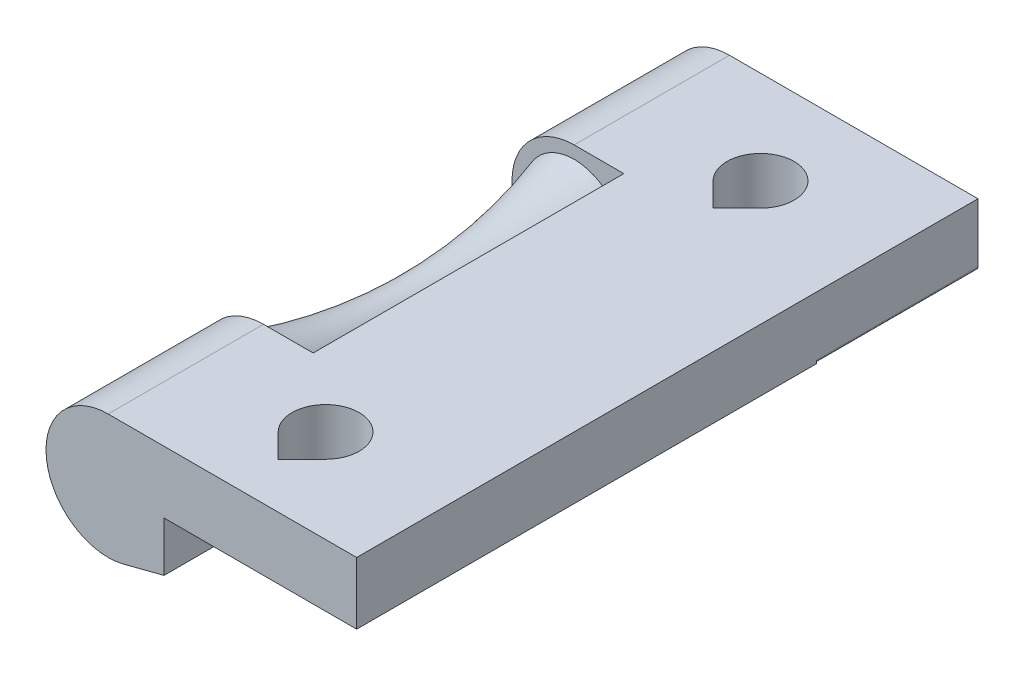
ISO-10303-21;
HEADER;
FILE_DESCRIPTION(('STEP AP214'),'2;1');
FILE_NAME('part.step','',(''),(''),'','','');
FILE_SCHEMA(('AUTOMOTIVE_DESIGN { 1 0 10303 214 1 1 1 1 }'));
ENDSEC;
DATA;
#1=APPLICATION_CONTEXT('core data for automotive mechanical design processes');
#2=APPLICATION_PROTOCOL_DEFINITION('international standard','automotive_design',2000,#1);
#3=PRODUCT_CONTEXT('',#1,'mechanical');
#4=PRODUCT('Part','Part','',(#3));
#5=PRODUCT_RELATED_PRODUCT_CATEGORY('part','',(#4));
#6=PRODUCT_DEFINITION_FORMATION('','',#4);
#7=PRODUCT_DEFINITION_CONTEXT('part definition',#1,'design');
#8=PRODUCT_DEFINITION('design','',#6,#7);
#9=PRODUCT_DEFINITION_SHAPE('','',#8);
#10=(LENGTH_UNIT() NAMED_UNIT(*) SI_UNIT(.MILLI.,.METRE.));
#11=(NAMED_UNIT(*) PLANE_ANGLE_UNIT() SI_UNIT($,.RADIAN.));
#12=(NAMED_UNIT(*) SI_UNIT($,.STERADIAN.) SOLID_ANGLE_UNIT());
#13=UNCERTAINTY_MEASURE_WITH_UNIT(LENGTH_MEASURE(1.E-05),#10,'distance_accuracy_value','');
#14=(GEOMETRIC_REPRESENTATION_CONTEXT(3) GLOBAL_UNCERTAINTY_ASSIGNED_CONTEXT((#13)) GLOBAL_UNIT_ASSIGNED_CONTEXT((#10,
#11,#12)) REPRESENTATION_CONTEXT('',''));
#15=CARTESIAN_POINT('',(0.,0.,0.));
#16=DIRECTION('',(0.,0.,1.));
#17=DIRECTION('',(1.,0.,0.));
#18=AXIS2_PLACEMENT_3D('',#15,#16,#17);
#19=CARTESIAN_POINT('',(20.,0.,0.));
#20=DIRECTION('',(-1.,0.,0.));
#21=DIRECTION('',(0.,0.,1.));
#22=AXIS2_PLACEMENT_3D('',#19,#20,#21);
#23=PLANE('',#22);
#24=DIRECTION('',(0.,0.,1.));
#25=VECTOR('',#24,1.);
#26=CARTESIAN_POINT('',(20.,0.,-12.));
#27=LINE('',#26,#25);
#28=CARTESIAN_POINT('',(20.,0.,-12.));
#29=VERTEX_POINT('',#28);
#30=CARTESIAN_POINT('',(20.,0.,12.));
#31=VERTEX_POINT('',#30);
#32=EDGE_CURVE('E373',#29,#31,#27,.T.);
#33=ORIENTED_EDGE('',*,*,#32,.F.);
#34=DIRECTION('',(0.,1.,0.));
#35=VECTOR('',#34,1.);
#36=CARTESIAN_POINT('',(20.,0.,-12.));
#37=LINE('',#36,#35);
#38=CARTESIAN_POINT('',(20.,0.25,-12.));
#39=VERTEX_POINT('',#38);
#40=EDGE_CURVE('E56',#29,#39,#37,.T.);
#41=ORIENTED_EDGE('',*,*,#40,.T.);
#42=DIRECTION('',(0.,0.,1.));
#43=VECTOR('',#42,1.);
#44=CARTESIAN_POINT('',(20.,0.25,-25.));
#45=LINE('',#44,#43);
#46=CARTESIAN_POINT('',(20.,0.25,-25.));
#47=VERTEX_POINT('',#46);
#48=EDGE_CURVE('E829',#39,#47,#45,.F.);
#49=ORIENTED_EDGE('',*,*,#48,.T.);
#50=DIRECTION('',(0.,-1.,0.));
#51=VECTOR('',#50,1.);
#52=CARTESIAN_POINT('',(20.,0.,-25.));
#53=LINE('',#52,#51);
#54=CARTESIAN_POINT('',(20.,5.00000000000002,-25.));
#55=VERTEX_POINT('',#54);
#56=EDGE_CURVE('E269',#55,#47,#53,.T.);
#57=ORIENTED_EDGE('',*,*,#56,.F.);
#58=DIRECTION('',(0.,0.,1.));
#59=VECTOR('',#58,1.);
#60=CARTESIAN_POINT('',(20.,5.00000000000002,25.000000372529));
#61=LINE('',#60,#59);
#62=CARTESIAN_POINT('',(20.,5.00000000000002,25.000000372529));
#63=VERTEX_POINT('',#62);
#64=EDGE_CURVE('E378',#55,#63,#61,.T.);
#65=ORIENTED_EDGE('',*,*,#64,.T.);
#66=DIRECTION('',(0.,-1.,0.));
#67=VECTOR('',#66,1.);
#68=CARTESIAN_POINT('',(20.,-4.00208279108101,25.000000372529));
#69=LINE('',#68,#67);
#70=CARTESIAN_POINT('',(20.,0.,25.000000372529));
#71=VERTEX_POINT('',#70);
#72=EDGE_CURVE('E381',#63,#71,#69,.T.);
#73=ORIENTED_EDGE('',*,*,#72,.T.);
#74=DIRECTION('',(0.,0.,1.));
#75=VECTOR('',#74,1.);
#76=CARTESIAN_POINT('',(20.,0.,12.));
#77=LINE('',#76,#75);
#78=EDGE_CURVE('E290',#31,#71,#77,.T.);
#79=ORIENTED_EDGE('',*,*,#78,.F.);
#80=EDGE_LOOP('',(#33,#41,#49,#57,#65,#73,#79));
#81=FACE_BOUND('',#80,.T.);
#82=ADVANCED_FACE('F42',(#81),#23,.F.);
#83=CARTESIAN_POINT('',(20.,5.00000000000002,-25.));
#84=DIRECTION('',(0.,1.,0.));
#85=DIRECTION('',(0.,0.,1.));
#86=AXIS2_PLACEMENT_3D('',#83,#84,#85);
#87=PLANE('',#86);
#88=CARTESIAN_POINT('',(10.,5.00000000000002,-17.5));
#89=DIRECTION('',(0.,1.,0.));
#90=DIRECTION('',(0.,0.,1.));
#91=AXIS2_PLACEMENT_3D('',#88,#89,#90);
#92=CIRCLE('',#91,2.70000000000002);
#93=CARTESIAN_POINT('',(11.9091883092037,5.00000000000002,-15.5908116907963));
#94=VERTEX_POINT('',#93);
#95=CARTESIAN_POINT('',(8.09081169079631,5.00000000000002,-15.5908116907963));
#96=VERTEX_POINT('',#95);
#97=EDGE_CURVE('E228',#94,#96,#92,.T.);
#98=ORIENTED_EDGE('',*,*,#97,.F.);
#99=DIRECTION('',(0.707106781186544,0.,-0.707106781186551));
#100=VECTOR('',#99,1.);
#101=CARTESIAN_POINT('',(10.,5.00000000000002,-13.6816233815926));
#102=LINE('',#101,#100);
#103=CARTESIAN_POINT('',(10.,5.00000000000002,-13.6816233815926));
#104=VERTEX_POINT('',#103);
#105=EDGE_CURVE('E229',#104,#94,#102,.T.);
#106=ORIENTED_EDGE('',*,*,#105,.F.);
#107=DIRECTION('',(0.707106781186544,0.,0.707106781186551));
#108=VECTOR('',#107,1.);
#109=CARTESIAN_POINT('',(8.09081169079631,5.00000000000002,-15.5908116907963));
#110=LINE('',#109,#108);
#111=EDGE_CURVE('E235',#96,#104,#110,.T.);
#112=ORIENTED_EDGE('',*,*,#111,.F.);
#113=EDGE_LOOP('',(#98,#106,#112));
#114=FACE_BOUND('',#113,.T.);
#115=CARTESIAN_POINT('',(10.,5.00000000000002,17.5));
#116=DIRECTION('',(0.,1.,0.));
#117=DIRECTION('',(0.,0.,1.));
#118=AXIS2_PLACEMENT_3D('',#115,#116,#117);
#119=CIRCLE('',#118,2.70000000000001);
#120=CARTESIAN_POINT('',(11.9091883092037,5.00000000000002,19.4091883092037));
#121=VERTEX_POINT('',#120);
#122=CARTESIAN_POINT('',(8.09081169079631,5.00000000000002,19.4091883092037));
#123=VERTEX_POINT('',#122);
#124=EDGE_CURVE('E251',#121,#123,#119,.T.);
#125=ORIENTED_EDGE('',*,*,#124,.F.);
#126=DIRECTION('',(0.707106781186543,0.,-0.707106781186552));
#127=VECTOR('',#126,1.);
#128=CARTESIAN_POINT('',(10.,5.00000000000002,21.3183766184074));
#129=LINE('',#128,#127);
#130=CARTESIAN_POINT('',(10.,5.00000000000002,21.3183766184074));
#131=VERTEX_POINT('',#130);
#132=EDGE_CURVE('E256',#131,#121,#129,.T.);
#133=ORIENTED_EDGE('',*,*,#132,.F.);
#134=DIRECTION('',(0.707106781186543,0.,0.707106781186552));
#135=VECTOR('',#134,1.);
#136=CARTESIAN_POINT('',(8.09081169079631,5.00000000000002,19.4091883092037));
#137=LINE('',#136,#135);
#138=EDGE_CURVE('E253',#123,#131,#137,.T.);
#139=ORIENTED_EDGE('',*,*,#138,.F.);
#140=EDGE_LOOP('',(#125,#133,#139));
#141=FACE_BOUND('',#140,.T.);
#142=DIRECTION('',(0.,0.,1.));
#143=VECTOR('',#142,1.);
#144=CARTESIAN_POINT('',(0.,5.00000000000002,-25.));
#145=LINE('',#144,#143);
#146=CARTESIAN_POINT('',(0.,5.00000000000002,-25.));
#147=VERTEX_POINT('',#146);
#148=CARTESIAN_POINT('',(0.,5.00000000000002,-12.5));
#149=VERTEX_POINT('',#148);
#150=EDGE_CURVE('E397',#147,#149,#145,.T.);
#151=ORIENTED_EDGE('',*,*,#150,.T.);
#152=DIRECTION('',(-1.,0.,0.));
#153=VECTOR('',#152,1.);
#154=CARTESIAN_POINT('',(3.99999999999998,5.00000000000002,-12.5));
#155=LINE('',#154,#153);
#156=CARTESIAN_POINT('',(3.99999999999998,5.00000000000002,-12.5));
#157=VERTEX_POINT('',#156);
#158=EDGE_CURVE('E323',#157,#149,#155,.T.);
#159=ORIENTED_EDGE('',*,*,#158,.F.);
#160=DIRECTION('',(0.,0.,1.));
#161=VECTOR('',#160,1.);
#162=CARTESIAN_POINT('',(3.99999999999998,5.00000000000002,-12.5));
#163=LINE('',#162,#161);
#164=CARTESIAN_POINT('',(3.99999999999998,5.00000000000002,12.5));
#165=VERTEX_POINT('',#164);
#166=EDGE_CURVE('E340',#157,#165,#163,.T.);
#167=ORIENTED_EDGE('',*,*,#166,.T.);
#168=DIRECTION('',(-1.,0.,0.));
#169=VECTOR('',#168,1.);
#170=CARTESIAN_POINT('',(3.99999999999998,5.00000000000002,12.5));
#171=LINE('',#170,#169);
#172=CARTESIAN_POINT('',(0.,5.00000000000002,12.5));
#173=VERTEX_POINT('',#172);
#174=EDGE_CURVE('E343',#165,#173,#171,.T.);
#175=ORIENTED_EDGE('',*,*,#174,.T.);
#176=CARTESIAN_POINT('',(0.,5.00000000000001,25.000000372529));
#177=VERTEX_POINT('',#176);
#178=EDGE_CURVE('E403',#173,#177,#145,.T.);
#179=ORIENTED_EDGE('',*,*,#178,.T.);
#180=DIRECTION('',(-1.,0.,0.));
#181=VECTOR('',#180,1.);
#182=CARTESIAN_POINT('',(0.,5.00000000000002,25.000000372529));
#183=LINE('',#182,#181);
#184=EDGE_CURVE('E384',#63,#177,#183,.T.);
#185=ORIENTED_EDGE('',*,*,#184,.F.);
#186=ORIENTED_EDGE('',*,*,#64,.F.);
#187=DIRECTION('',(1.,0.,0.));
#188=VECTOR('',#187,1.);
#189=CARTESIAN_POINT('',(20.,5.00000000000002,-25.));
#190=LINE('',#189,#188);
#191=EDGE_CURVE('E282',#147,#55,#190,.T.);
#192=ORIENTED_EDGE('',*,*,#191,.F.);
#193=EDGE_LOOP('',(#151,#159,#167,#175,#179,#185,#186,#192));
#194=FACE_BOUND('',#193,.T.);
#195=ADVANCED_FACE('F866',(#114,#141,#194),#87,.T.);
#196=CARTESIAN_POINT('',(1.25000000000004,-4.84122918275929,-25.));
#197=DIRECTION('',(0.250000000000001,-0.968245836551854,0.));
#198=DIRECTION('',(0.968245836551854,0.250000000000001,0.));
#199=AXIS2_PLACEMENT_3D('',#196,#197,#198);
#200=PLANE('',#199);
#201=DIRECTION('',(0.,0.,1.));
#202=VECTOR('',#201,1.);
#203=CARTESIAN_POINT('',(4.31249999999998,-4.05049508290861,-12.5));
#204=LINE('',#203,#202);
#205=CARTESIAN_POINT('',(4.31249999999998,-4.05049508290861,-12.5));
#206=VERTEX_POINT('',#205);
#207=CARTESIAN_POINT('',(4.31249999999998,-4.05049508290861,12.5));
#208=VERTEX_POINT('',#207);
#209=EDGE_CURVE('E367',#206,#208,#204,.T.);
#210=ORIENTED_EDGE('',*,*,#209,.F.);
#211=DIRECTION('',(0.968245836551854,0.250000000000001,0.));
#212=VECTOR('',#211,1.);
#213=CARTESIAN_POINT('',(1.25,-4.84122918275929,-12.5));
#214=LINE('',#213,#212);
#215=CARTESIAN_POINT('',(1.25,-4.84122918275929,-12.5));
#216=VERTEX_POINT('',#215);
#217=EDGE_CURVE('E328',#216,#206,#214,.T.);
#218=ORIENTED_EDGE('',*,*,#217,.F.);
#219=DIRECTION('',(0.,0.,-1.));
#220=VECTOR('',#219,1.);
#221=CARTESIAN_POINT('',(1.24999999999998,-4.84122918275925,18.7500001862645));
#222=LINE('',#221,#220);
#223=CARTESIAN_POINT('',(1.25000000000004,-4.84122918275929,-25.));
#224=VERTEX_POINT('',#223);
#225=EDGE_CURVE('E404',#224,#216,#222,.F.);
#226=ORIENTED_EDGE('',*,*,#225,.F.);
#227=DIRECTION('',(-0.968245836551854,-0.250000000000001,0.));
#228=VECTOR('',#227,1.);
#229=CARTESIAN_POINT('',(1.25000000000004,-4.84122918275929,-25.));
#230=LINE('',#229,#228);
#231=CARTESIAN_POINT('',(4.5,-4.00208279108102,-25.));
#232=VERTEX_POINT('',#231);
#233=EDGE_CURVE('E276',#232,#224,#230,.T.);
#234=ORIENTED_EDGE('',*,*,#233,.F.);
#235=DIRECTION('',(0.,0.,1.));
#236=VECTOR('',#235,1.);
#237=CARTESIAN_POINT('',(4.5,-4.00208279108102,-25.));
#238=LINE('',#237,#236);
#239=CARTESIAN_POINT('',(4.49999999999999,-4.00208279108102,-17.5));
#240=VERTEX_POINT('',#239);
#241=EDGE_CURVE('E285',#232,#240,#238,.T.);
#242=ORIENTED_EDGE('',*,*,#241,.T.);
#243=CARTESIAN_POINT('',(10.,-2.58198889747163,-17.5));
#244=DIRECTION('',(0.250000000000001,-0.968245836551854,0.));
#245=DIRECTION('',(0.968245836551854,0.250000000000001,0.));
#246=AXIS2_PLACEMENT_3D('',#243,#244,#245);
#247=ELLIPSE('',#246,5.68037557443755,5.5);
#248=CARTESIAN_POINT('',(10.,-2.58198889747163,-12.));
#249=VERTEX_POINT('',#248);
#250=EDGE_CURVE('E396',#240,#249,#247,.F.);
#251=ORIENTED_EDGE('',*,*,#250,.T.);
#252=DIRECTION('',(-0.968245836551854,-0.250000000000001,0.));
#253=VECTOR('',#252,1.);
#254=CARTESIAN_POINT('',(20.,0.,-12.));
#255=LINE('',#254,#253);
#256=EDGE_CURVE('E371',#29,#249,#255,.T.);
#257=ORIENTED_EDGE('',*,*,#256,.F.);
#258=ORIENTED_EDGE('',*,*,#32,.T.);
#259=DIRECTION('',(-0.968245836551854,-0.250000000000001,0.));
#260=VECTOR('',#259,1.);
#261=CARTESIAN_POINT('',(20.,0.,12.));
#262=LINE('',#261,#260);
#263=CARTESIAN_POINT('',(10.,-2.58198889747162,12.));
#264=VERTEX_POINT('',#263);
#265=EDGE_CURVE('E362',#31,#264,#262,.T.);
#266=ORIENTED_EDGE('',*,*,#265,.T.);
#267=CARTESIAN_POINT('',(10.,-2.58198889747162,17.5));
#268=DIRECTION('',(0.250000000000001,-0.968245836551854,0.));
#269=DIRECTION('',(0.968245836551854,0.250000000000001,0.));
#270=AXIS2_PLACEMENT_3D('',#267,#268,#269);
#271=ELLIPSE('',#270,5.68037557443755,5.5);
#272=CARTESIAN_POINT('',(4.5,-4.00208279108101,17.5));
#273=VERTEX_POINT('',#272);
#274=EDGE_CURVE('E817',#264,#273,#271,.F.);
#275=ORIENTED_EDGE('',*,*,#274,.T.);
#276=DIRECTION('',(0.,0.,-1.));
#277=VECTOR('',#276,1.);
#278=CARTESIAN_POINT('',(4.50000000000001,-4.00208279108101,25.000000372529));
#279=LINE('',#278,#277);
#280=CARTESIAN_POINT('',(4.5,-4.00208279108101,25.000000372529));
#281=VERTEX_POINT('',#280);
#282=EDGE_CURVE('E393',#281,#273,#279,.T.);
#283=ORIENTED_EDGE('',*,*,#282,.F.);
#284=DIRECTION('',(0.968245836551856,0.249999999999992,0.));
#285=VECTOR('',#284,1.);
#286=CARTESIAN_POINT('',(4.50000000000001,-4.00208279108101,25.000000372529));
#287=LINE('',#286,#285);
#288=CARTESIAN_POINT('',(1.24999999999999,-4.84122918275926,25.000000372529));
#289=VERTEX_POINT('',#288);
#290=EDGE_CURVE('E390',#289,#281,#287,.T.);
#291=ORIENTED_EDGE('',*,*,#290,.F.);
#292=CARTESIAN_POINT('',(1.24999999999999,-4.84122918275925,12.5));
#293=VERTEX_POINT('',#292);
#294=EDGE_CURVE('E816',#293,#289,#222,.F.);
#295=ORIENTED_EDGE('',*,*,#294,.F.);
#296=DIRECTION('',(0.968245836551854,0.250000000000001,0.));
#297=VECTOR('',#296,1.);
#298=CARTESIAN_POINT('',(1.25,-4.84122918275929,12.5));
#299=LINE('',#298,#297);
#300=EDGE_CURVE('E349',#293,#208,#299,.T.);
#301=ORIENTED_EDGE('',*,*,#300,.T.);
#302=EDGE_LOOP('',(#210,#218,#226,#234,#242,#251,#257,#258,#266,#275,#283,#291,#295,#301));
#303=FACE_BOUND('',#302,.T.);
#304=ADVANCED_FACE('F846',(#303),#200,.T.);
#305=CARTESIAN_POINT('',(0.,0.,18.7500001862645));
#306=DIRECTION('',(0.,0.,-1.));
#307=DIRECTION('',(-1.,0.,0.));
#308=AXIS2_PLACEMENT_3D('',#305,#306,#307);
#309=CYLINDRICAL_SURFACE('',#308,4.99999999999998);
#310=ORIENTED_EDGE('',*,*,#225,.T.);
#311=CARTESIAN_POINT('',(0.,0.,-12.5));
#312=DIRECTION('',(0.,0.,1.));
#313=DIRECTION('',(1.,0.,0.));
#314=AXIS2_PLACEMENT_3D('',#311,#312,#313);
#315=CIRCLE('',#314,5.00000000000002);
#316=EDGE_CURVE('E326',#149,#216,#315,.T.);
#317=ORIENTED_EDGE('',*,*,#316,.F.);
#318=ORIENTED_EDGE('',*,*,#150,.F.);
#319=CARTESIAN_POINT('',(0.,0.,-25.));
#320=DIRECTION('',(0.,0.,-1.));
#321=DIRECTION('',(1.,0.,0.));
#322=AXIS2_PLACEMENT_3D('',#319,#320,#321);
#323=CIRCLE('',#322,5.00000000000002);
#324=EDGE_CURVE('E279',#224,#147,#323,.T.);
#325=ORIENTED_EDGE('',*,*,#324,.F.);
#326=EDGE_LOOP('',(#310,#317,#318,#325));
#327=FACE_BOUND('',#326,.T.);
#328=ADVANCED_FACE('F862',(#327),#309,.T.);
#329=CARTESIAN_POINT('',(0.,0.,12.5));
#330=DIRECTION('',(0.,0.,1.));
#331=DIRECTION('',(1.,0.,0.));
#332=AXIS2_PLACEMENT_3D('',#329,#330,#331);
#333=CIRCLE('',#332,5.00000000000002);
#334=EDGE_CURVE('E346',#173,#293,#333,.T.);
#335=ORIENTED_EDGE('',*,*,#334,.T.);
#336=ORIENTED_EDGE('',*,*,#294,.T.);
#337=CARTESIAN_POINT('',(0.,0.,25.000000372529));
#338=DIRECTION('',(0.,0.,1.));
#339=DIRECTION('',(-1.,0.,0.));
#340=AXIS2_PLACEMENT_3D('',#337,#338,#339);
#341=CIRCLE('',#340,5.00000000000001);
#342=EDGE_CURVE('E387',#177,#289,#341,.T.);
#343=ORIENTED_EDGE('',*,*,#342,.F.);
#344=ORIENTED_EDGE('',*,*,#178,.F.);
#345=EDGE_LOOP('',(#335,#336,#343,#344));
#346=FACE_BOUND('',#345,.T.);
#347=ADVANCED_FACE('F909',(#346),#309,.T.);
#348=CARTESIAN_POINT('',(0.,0.,25.000000372529));
#349=DIRECTION('',(0.,0.,-1.));
#350=DIRECTION('',(-1.,0.,0.));
#351=AXIS2_PLACEMENT_3D('',#348,#349,#350);
#352=PLANE('',#351);
#353=DIRECTION('',(0.,-1.,0.));
#354=VECTOR('',#353,1.);
#355=CARTESIAN_POINT('',(4.5,-2.58198889747162,25.000000372529));
#356=LINE('',#355,#354);
#357=CARTESIAN_POINT('',(4.5,0.,25.000000372529));
#358=VERTEX_POINT('',#357);
#359=EDGE_CURVE('E306',#358,#281,#356,.T.);
#360=ORIENTED_EDGE('',*,*,#359,.F.);
#361=DIRECTION('',(-1.,0.,0.));
#362=VECTOR('',#361,1.);
#363=CARTESIAN_POINT('',(20.,0.,25.000000372529));
#364=LINE('',#363,#362);
#365=EDGE_CURVE('E292',#71,#358,#364,.T.);
#366=ORIENTED_EDGE('',*,*,#365,.F.);
#367=ORIENTED_EDGE('',*,*,#72,.F.);
#368=ORIENTED_EDGE('',*,*,#184,.T.);
#369=ORIENTED_EDGE('',*,*,#342,.T.);
#370=ORIENTED_EDGE('',*,*,#290,.T.);
#371=EDGE_LOOP('',(#360,#366,#367,#368,#369,#370));
#372=FACE_BOUND('',#371,.T.);
#373=ADVANCED_FACE('F870',(#372),#352,.F.);
#374=CARTESIAN_POINT('',(3.99999999999998,3.40036762718386,-12.5));
#375=DIRECTION('',(1.,0.,0.));
#376=DIRECTION('',(0.,1.,0.));
#377=AXIS2_PLACEMENT_3D('',#374,#375,#376);
#378=PLANE('',#377);
#379=DIRECTION('',(0.,1.,0.));
#380=VECTOR('',#379,1.);
#381=CARTESIAN_POINT('',(3.99999999999998,3.40036762718386,12.5));
#382=LINE('',#381,#380);
#383=CARTESIAN_POINT('',(3.99999999999998,3.40036762718386,12.5));
#384=VERTEX_POINT('',#383);
#385=EDGE_CURVE('E319',#384,#165,#382,.T.);
#386=ORIENTED_EDGE('',*,*,#385,.T.);
#387=ORIENTED_EDGE('',*,*,#166,.F.);
#388=DIRECTION('',(0.,1.,0.));
#389=VECTOR('',#388,1.);
#390=CARTESIAN_POINT('',(3.99999999999998,3.40036762718386,-12.5));
#391=LINE('',#390,#389);
#392=CARTESIAN_POINT('',(3.99999999999998,3.40036762718386,-12.5));
#393=VERTEX_POINT('',#392);
#394=EDGE_CURVE('E320',#393,#157,#391,.T.);
#395=ORIENTED_EDGE('',*,*,#394,.F.);
#396=DIRECTION('',(0.,0.,1.));
#397=VECTOR('',#396,1.);
#398=CARTESIAN_POINT('',(3.99999999999998,3.40036762718386,-12.5));
#399=LINE('',#398,#397);
#400=EDGE_CURVE('E360',#393,#384,#399,.T.);
#401=ORIENTED_EDGE('',*,*,#400,.T.);
#402=EDGE_LOOP('',(#386,#387,#395,#401));
#403=FACE_BOUND('',#402,.T.);
#404=ADVANCED_FACE('F1003',(#403),#378,.F.);
#405=CARTESIAN_POINT('',(0.,0.,-12.5));
#406=DIRECTION('',(0.,0.,1.));
#407=DIRECTION('',(1.,0.,0.));
#408=AXIS2_PLACEMENT_3D('',#405,#406,#407);
#409=CYLINDRICAL_SURFACE('',#408,5.24999999999999);
#410=CARTESIAN_POINT('',(0.,0.,12.5));
#411=DIRECTION('',(0.,0.,1.));
#412=DIRECTION('',(1.,0.,0.));
#413=AXIS2_PLACEMENT_3D('',#410,#411,#412);
#414=CIRCLE('',#413,5.24999999999999);
#415=CARTESIAN_POINT('',(3.99999999999998,-3.40036762718386,12.5));
#416=VERTEX_POINT('',#415);
#417=EDGE_CURVE('E324',#416,#384,#414,.T.);
#418=ORIENTED_EDGE('',*,*,#417,.T.);
#419=ORIENTED_EDGE('',*,*,#400,.F.);
#420=CARTESIAN_POINT('',(0.,0.,-12.5));
#421=DIRECTION('',(0.,0.,1.));
#422=DIRECTION('',(1.,0.,0.));
#423=AXIS2_PLACEMENT_3D('',#420,#421,#422);
#424=CIRCLE('',#423,5.24999999999999);
#425=CARTESIAN_POINT('',(3.99999999999998,-3.40036762718386,-12.5));
#426=VERTEX_POINT('',#425);
#427=EDGE_CURVE('E337',#426,#393,#424,.T.);
#428=ORIENTED_EDGE('',*,*,#427,.F.);
#429=DIRECTION('',(0.,0.,1.));
#430=VECTOR('',#429,1.);
#431=CARTESIAN_POINT('',(3.99999999999998,-3.40036762718386,-12.5));
#432=LINE('',#431,#430);
#433=EDGE_CURVE('E363',#426,#416,#432,.T.);
#434=ORIENTED_EDGE('',*,*,#433,.T.);
#435=EDGE_LOOP('',(#418,#419,#428,#434));
#436=FACE_BOUND('',#435,.T.);
#437=ADVANCED_FACE('F1029',(#436),#409,.F.);
#438=CARTESIAN_POINT('',(3.99999999999998,-3.80843362377065,-12.5));
#439=DIRECTION('',(1.,0.,0.));
#440=DIRECTION('',(0.,0.,-1.));
#441=AXIS2_PLACEMENT_3D('',#438,#439,#440);
#442=PLANE('',#441);
#443=DIRECTION('',(0.,1.,0.));
#444=VECTOR('',#443,1.);
#445=CARTESIAN_POINT('',(3.99999999999998,-3.80843362377065,12.5));
#446=LINE('',#445,#444);
#447=CARTESIAN_POINT('',(3.99999999999998,-3.80843362377065,12.5));
#448=VERTEX_POINT('',#447);
#449=EDGE_CURVE('E355',#448,#416,#446,.T.);
#450=ORIENTED_EDGE('',*,*,#449,.T.);
#451=ORIENTED_EDGE('',*,*,#433,.F.);
#452=DIRECTION('',(0.,1.,0.));
#453=VECTOR('',#452,1.);
#454=CARTESIAN_POINT('',(3.99999999999998,-3.80843362377065,-12.5));
#455=LINE('',#454,#453);
#456=CARTESIAN_POINT('',(3.99999999999998,-3.80843362377065,-12.5));
#457=VERTEX_POINT('',#456);
#458=EDGE_CURVE('E334',#457,#426,#455,.T.);
#459=ORIENTED_EDGE('',*,*,#458,.F.);
#460=DIRECTION('',(0.,0.,1.));
#461=VECTOR('',#460,1.);
#462=CARTESIAN_POINT('',(3.99999999999998,-3.80843362377065,-12.5));
#463=LINE('',#462,#461);
#464=EDGE_CURVE('E365',#457,#448,#463,.T.);
#465=ORIENTED_EDGE('',*,*,#464,.T.);
#466=EDGE_LOOP('',(#450,#451,#459,#465));
#467=FACE_BOUND('',#466,.T.);
#468=ADVANCED_FACE('F1017',(#467),#442,.F.);
#469=CARTESIAN_POINT('',(4.24999999999998,-3.80843362377065,-12.5));
#470=DIRECTION('',(0.,0.,1.));
#471=DIRECTION('',(1.,0.,0.));
#472=AXIS2_PLACEMENT_3D('',#469,#470,#471);
#473=CYLINDRICAL_SURFACE('',#472,0.249999999999999);
#474=CARTESIAN_POINT('',(4.24999999999998,-3.80843362377065,12.5));
#475=DIRECTION('',(0.,0.,-1.));
#476=DIRECTION('',(-1.,0.,0.));
#477=AXIS2_PLACEMENT_3D('',#474,#475,#476);
#478=CIRCLE('',#477,0.249999999999999);
#479=EDGE_CURVE('E352',#208,#448,#478,.T.);
#480=ORIENTED_EDGE('',*,*,#479,.T.);
#481=ORIENTED_EDGE('',*,*,#464,.F.);
#482=CARTESIAN_POINT('',(4.24999999999998,-3.80843362377065,-12.5));
#483=DIRECTION('',(0.,0.,-1.));
#484=DIRECTION('',(-1.,0.,0.));
#485=AXIS2_PLACEMENT_3D('',#482,#483,#484);
#486=CIRCLE('',#485,0.249999999999999);
#487=EDGE_CURVE('E331',#206,#457,#486,.T.);
#488=ORIENTED_EDGE('',*,*,#487,.F.);
#489=ORIENTED_EDGE('',*,*,#209,.T.);
#490=EDGE_LOOP('',(#480,#481,#488,#489));
#491=FACE_BOUND('',#490,.T.);
#492=ADVANCED_FACE('F1011',(#491),#473,.T.);
#493=CARTESIAN_POINT('',(0.,0.,-12.5));
#494=DIRECTION('',(0.,0.,1.));
#495=DIRECTION('',(1.,0.,0.));
#496=AXIS2_PLACEMENT_3D('',#493,#494,#495);
#497=PLANE('',#496);
#498=CARTESIAN_POINT('',(0.,0.,-12.5));
#499=DIRECTION('',(0.,0.,-1.));
#500=DIRECTION('',(-1.,0.,0.));
#501=AXIS2_PLACEMENT_3D('',#498,#499,#500);
#502=CIRCLE('',#501,4.00000000000002);
#503=CARTESIAN_POINT('',(-4.00000000000002,0.,-12.5));
#504=VERTEX_POINT('',#503);
#505=EDGE_CURVE('E402',#504,#504,#502,.F.);
#506=ORIENTED_EDGE('',*,*,#505,.F.);
#507=EDGE_LOOP('',(#506));
#508=FACE_BOUND('',#507,.T.);
#509=ORIENTED_EDGE('',*,*,#394,.T.);
#510=ORIENTED_EDGE('',*,*,#158,.T.);
#511=ORIENTED_EDGE('',*,*,#316,.T.);
#512=ORIENTED_EDGE('',*,*,#217,.T.);
#513=ORIENTED_EDGE('',*,*,#487,.T.);
#514=ORIENTED_EDGE('',*,*,#458,.T.);
#515=ORIENTED_EDGE('',*,*,#427,.T.);
#516=EDGE_LOOP('',(#509,#510,#511,#512,#513,#514,#515));
#517=FACE_BOUND('',#516,.T.);
#518=ADVANCED_FACE('F1016',(#508,#517),#497,.T.);
#519=CARTESIAN_POINT('',(0.,0.,12.5));
#520=DIRECTION('',(0.,0.,1.));
#521=DIRECTION('',(1.,0.,0.));
#522=AXIS2_PLACEMENT_3D('',#519,#520,#521);
#523=PLANE('',#522);
#524=CARTESIAN_POINT('',(0.,0.,12.5));
#525=DIRECTION('',(0.,0.,-1.));
#526=DIRECTION('',(-1.,0.,0.));
#527=AXIS2_PLACEMENT_3D('',#524,#525,#526);
#528=CIRCLE('',#527,4.);
#529=CARTESIAN_POINT('',(-4.00000000000001,0.,12.5));
#530=VERTEX_POINT('',#529);
#531=EDGE_CURVE('E237',#530,#530,#528,.T.);
#532=ORIENTED_EDGE('',*,*,#531,.F.);
#533=EDGE_LOOP('',(#532));
#534=FACE_BOUND('',#533,.T.);
#535=ORIENTED_EDGE('',*,*,#385,.F.);
#536=ORIENTED_EDGE('',*,*,#417,.F.);
#537=ORIENTED_EDGE('',*,*,#449,.F.);
#538=ORIENTED_EDGE('',*,*,#479,.F.);
#539=ORIENTED_EDGE('',*,*,#300,.F.);
#540=ORIENTED_EDGE('',*,*,#334,.F.);
#541=ORIENTED_EDGE('',*,*,#174,.F.);
#542=EDGE_LOOP('',(#535,#536,#537,#538,#539,#540,#541));
#543=FACE_BOUND('',#542,.T.);
#544=ADVANCED_FACE('F1072',(#534,#543),#523,.F.);
#545=CARTESIAN_POINT('',(10.,-2.58198889747163,-17.5));
#546=DIRECTION('',(0.,-1.,0.));
#547=DIRECTION('',(0.,0.,-1.));
#548=AXIS2_PLACEMENT_3D('',#545,#546,#547);
#549=CYLINDRICAL_SURFACE('',#548,5.5);
#550=ORIENTED_EDGE('',*,*,#250,.F.);
#551=DIRECTION('',(0.,-1.,0.));
#552=VECTOR('',#551,1.);
#553=CARTESIAN_POINT('',(4.49999999999999,-2.58198889747163,-17.5));
#554=LINE('',#553,#552);
#555=CARTESIAN_POINT('',(4.49999999999999,0.,-17.5));
#556=VERTEX_POINT('',#555);
#557=EDGE_CURVE('E317',#556,#240,#554,.T.);
#558=ORIENTED_EDGE('',*,*,#557,.F.);
#559=CARTESIAN_POINT('',(10.,0.,-17.5));
#560=DIRECTION('',(0.,-1.,0.));
#561=DIRECTION('',(0.,0.,-1.));
#562=AXIS2_PLACEMENT_3D('',#559,#560,#561);
#563=CIRCLE('',#562,5.5);
#564=CARTESIAN_POINT('',(10.,0.,-12.));
#565=VERTEX_POINT('',#564);
#566=EDGE_CURVE('E309',#565,#556,#563,.T.);
#567=ORIENTED_EDGE('',*,*,#566,.F.);
#568=DIRECTION('',(0.,-1.,0.));
#569=VECTOR('',#568,1.);
#570=CARTESIAN_POINT('',(10.,0.,-12.));
#571=LINE('',#570,#569);
#572=EDGE_CURVE('E315',#565,#249,#571,.T.);
#573=ORIENTED_EDGE('',*,*,#572,.T.);
#574=EDGE_LOOP('',(#550,#558,#567,#573));
#575=FACE_BOUND('',#574,.T.);
#576=ADVANCED_FACE('F853',(#575),#549,.F.);
#577=CARTESIAN_POINT('',(20.,0.,-12.));
#578=DIRECTION('',(0.,0.,1.));
#579=DIRECTION('',(1.,0.,0.));
#580=AXIS2_PLACEMENT_3D('',#577,#578,#579);
#581=PLANE('',#580);
#582=ORIENTED_EDGE('',*,*,#256,.T.);
#583=ORIENTED_EDGE('',*,*,#572,.F.);
#584=DIRECTION('',(-1.,0.,0.));
#585=VECTOR('',#584,1.);
#586=CARTESIAN_POINT('',(20.,0.,-12.));
#587=LINE('',#586,#585);
#588=CARTESIAN_POINT('',(19.75,0.,-12.));
#589=VERTEX_POINT('',#588);
#590=EDGE_CURVE('E313',#589,#565,#587,.T.);
#591=ORIENTED_EDGE('',*,*,#590,.F.);
#592=CARTESIAN_POINT('',(19.75,0.25,-12.));
#593=DIRECTION('',(0.,0.,1.));
#594=DIRECTION('',(1.,0.,0.));
#595=AXIS2_PLACEMENT_3D('',#592,#593,#594);
#596=CIRCLE('',#595,0.25);
#597=EDGE_CURVE('E12',#589,#39,#596,.T.);
#598=ORIENTED_EDGE('',*,*,#597,.T.);
#599=ORIENTED_EDGE('',*,*,#40,.F.);
#600=EDGE_LOOP('',(#582,#583,#591,#598,#599));
#601=FACE_BOUND('',#600,.T.);
#602=ADVANCED_FACE('F849',(#601),#581,.F.);
#603=CARTESIAN_POINT('',(10.,0.,-17.5));
#604=DIRECTION('',(0.,-1.,0.));
#605=DIRECTION('',(0.,0.,-1.));
#606=AXIS2_PLACEMENT_3D('',#603,#604,#605);
#607=PLANE('',#606);
#608=CARTESIAN_POINT('',(10.,0.,-17.5));
#609=DIRECTION('',(0.,-1.,0.));
#610=DIRECTION('',(0.,0.,-1.));
#611=AXIS2_PLACEMENT_3D('',#608,#609,#610);
#612=CIRCLE('',#611,2.70000000000002);
#613=CARTESIAN_POINT('',(11.9091883092037,0.,-15.5908116907963));
#614=VERTEX_POINT('',#613);
#615=CARTESIAN_POINT('',(8.09081169079631,0.,-15.5908116907963));
#616=VERTEX_POINT('',#615);
#617=EDGE_CURVE('E225',#614,#616,#612,.F.);
#618=ORIENTED_EDGE('',*,*,#617,.T.);
#619=DIRECTION('',(0.707106781186544,0.,0.707106781186551));
#620=VECTOR('',#619,1.);
#621=CARTESIAN_POINT('',(8.09081169079631,0.,-15.5908116907963));
#622=LINE('',#621,#620);
#623=CARTESIAN_POINT('',(10.,0.,-13.6816233815926));
#624=VERTEX_POINT('',#623);
#625=EDGE_CURVE('E209',#616,#624,#622,.T.);
#626=ORIENTED_EDGE('',*,*,#625,.T.);
#627=DIRECTION('',(0.707106781186544,0.,-0.707106781186551));
#628=VECTOR('',#627,1.);
#629=CARTESIAN_POINT('',(10.,0.,-13.6816233815926));
#630=LINE('',#629,#628);
#631=EDGE_CURVE('E233',#624,#614,#630,.T.);
#632=ORIENTED_EDGE('',*,*,#631,.T.);
#633=EDGE_LOOP('',(#618,#626,#632));
#634=FACE_BOUND('',#633,.T.);
#635=DIRECTION('',(-1.,0.,0.));
#636=VECTOR('',#635,1.);
#637=CARTESIAN_POINT('',(4.5,0.,-25.));
#638=LINE('',#637,#636);
#639=CARTESIAN_POINT('',(19.75,0.,-25.));
#640=VERTEX_POINT('',#639);
#641=CARTESIAN_POINT('',(4.5,0.,-25.));
#642=VERTEX_POINT('',#641);
#643=EDGE_CURVE('E272',#640,#642,#638,.T.);
#644=ORIENTED_EDGE('',*,*,#643,.F.);
#645=DIRECTION('',(0.,0.,1.));
#646=VECTOR('',#645,1.);
#647=CARTESIAN_POINT('',(19.75,0.,-12.));
#648=LINE('',#647,#646);
#649=EDGE_CURVE('E826',#640,#589,#648,.T.);
#650=ORIENTED_EDGE('',*,*,#649,.T.);
#651=ORIENTED_EDGE('',*,*,#590,.T.);
#652=ORIENTED_EDGE('',*,*,#566,.T.);
#653=DIRECTION('',(0.,0.,1.));
#654=VECTOR('',#653,1.);
#655=CARTESIAN_POINT('',(4.5,0.,-25.));
#656=LINE('',#655,#654);
#657=EDGE_CURVE('E288',#642,#556,#656,.T.);
#658=ORIENTED_EDGE('',*,*,#657,.F.);
#659=EDGE_LOOP('',(#644,#650,#651,#652,#658));
#660=FACE_BOUND('',#659,.T.);
#661=ADVANCED_FACE('F231',(#634,#660),#607,.T.);
#662=CARTESIAN_POINT('',(10.,-2.58198889747162,17.5));
#663=DIRECTION('',(0.,-1.,0.));
#664=DIRECTION('',(0.,0.,-1.));
#665=AXIS2_PLACEMENT_3D('',#662,#663,#664);
#666=CYLINDRICAL_SURFACE('',#665,5.5);
#667=ORIENTED_EDGE('',*,*,#274,.F.);
#668=DIRECTION('',(0.,-1.,0.));
#669=VECTOR('',#668,1.);
#670=CARTESIAN_POINT('',(10.,0.,12.));
#671=LINE('',#670,#669);
#672=CARTESIAN_POINT('',(10.,0.,12.));
#673=VERTEX_POINT('',#672);
#674=EDGE_CURVE('E304',#673,#264,#671,.T.);
#675=ORIENTED_EDGE('',*,*,#674,.F.);
#676=CARTESIAN_POINT('',(10.,0.,17.5));
#677=DIRECTION('',(0.,-1.,0.));
#678=DIRECTION('',(0.,0.,-1.));
#679=AXIS2_PLACEMENT_3D('',#676,#677,#678);
#680=CIRCLE('',#679,5.5);
#681=CARTESIAN_POINT('',(4.5,0.,17.5));
#682=VERTEX_POINT('',#681);
#683=EDGE_CURVE('E298',#682,#673,#680,.T.);
#684=ORIENTED_EDGE('',*,*,#683,.F.);
#685=DIRECTION('',(0.,-1.,0.));
#686=VECTOR('',#685,1.);
#687=CARTESIAN_POINT('',(4.5,-2.58198889747162,17.5));
#688=LINE('',#687,#686);
#689=EDGE_CURVE('E307',#682,#273,#688,.T.);
#690=ORIENTED_EDGE('',*,*,#689,.T.);
#691=EDGE_LOOP('',(#667,#675,#684,#690));
#692=FACE_BOUND('',#691,.T.);
#693=ADVANCED_FACE('F883',(#692),#666,.F.);
#694=CARTESIAN_POINT('',(4.5,-2.58198889747162,25.000000372529));
#695=DIRECTION('',(-1.,0.,0.));
#696=DIRECTION('',(0.,0.,1.));
#697=AXIS2_PLACEMENT_3D('',#694,#695,#696);
#698=PLANE('',#697);
#699=ORIENTED_EDGE('',*,*,#282,.T.);
#700=ORIENTED_EDGE('',*,*,#689,.F.);
#701=DIRECTION('',(0.,0.,-1.));
#702=VECTOR('',#701,1.);
#703=CARTESIAN_POINT('',(4.5,0.,25.000000372529));
#704=LINE('',#703,#702);
#705=EDGE_CURVE('E295',#358,#682,#704,.T.);
#706=ORIENTED_EDGE('',*,*,#705,.F.);
#707=ORIENTED_EDGE('',*,*,#359,.T.);
#708=EDGE_LOOP('',(#699,#700,#706,#707));
#709=FACE_BOUND('',#708,.T.);
#710=ADVANCED_FACE('F885',(#709),#698,.F.);
#711=CARTESIAN_POINT('',(10.,0.,12.));
#712=DIRECTION('',(0.,0.,-1.));
#713=DIRECTION('',(-1.,0.,0.));
#714=AXIS2_PLACEMENT_3D('',#711,#712,#713);
#715=PLANE('',#714);
#716=ORIENTED_EDGE('',*,*,#265,.F.);
#717=DIRECTION('',(1.,0.,0.));
#718=VECTOR('',#717,1.);
#719=CARTESIAN_POINT('',(10.,0.,12.));
#720=LINE('',#719,#718);
#721=EDGE_CURVE('E301',#673,#31,#720,.T.);
#722=ORIENTED_EDGE('',*,*,#721,.F.);
#723=ORIENTED_EDGE('',*,*,#674,.T.);
#724=EDGE_LOOP('',(#716,#722,#723));
#725=FACE_BOUND('',#724,.T.);
#726=ADVANCED_FACE('F878',(#725),#715,.F.);
#727=CARTESIAN_POINT('',(10.,0.,17.5));
#728=DIRECTION('',(0.,-1.,0.));
#729=DIRECTION('',(0.,0.,-1.));
#730=AXIS2_PLACEMENT_3D('',#727,#728,#729);
#731=PLANE('',#730);
#732=CARTESIAN_POINT('',(10.,0.,17.5));
#733=DIRECTION('',(0.,-1.,0.));
#734=DIRECTION('',(0.,0.,-1.));
#735=AXIS2_PLACEMENT_3D('',#732,#733,#734);
#736=CIRCLE('',#735,2.70000000000001);
#737=CARTESIAN_POINT('',(11.9091883092037,0.,19.4091883092037));
#738=VERTEX_POINT('',#737);
#739=CARTESIAN_POINT('',(8.09081169079631,0.,19.4091883092037));
#740=VERTEX_POINT('',#739);
#741=EDGE_CURVE('E248',#738,#740,#736,.F.);
#742=ORIENTED_EDGE('',*,*,#741,.T.);
#743=DIRECTION('',(0.707106781186543,0.,0.707106781186552));
#744=VECTOR('',#743,1.);
#745=CARTESIAN_POINT('',(8.09081169079631,0.,19.4091883092037));
#746=LINE('',#745,#744);
#747=CARTESIAN_POINT('',(10.,0.,21.3183766184074));
#748=VERTEX_POINT('',#747);
#749=EDGE_CURVE('E262',#740,#748,#746,.T.);
#750=ORIENTED_EDGE('',*,*,#749,.T.);
#751=DIRECTION('',(0.707106781186543,0.,-0.707106781186552));
#752=VECTOR('',#751,1.);
#753=CARTESIAN_POINT('',(10.,0.,21.3183766184074));
#754=LINE('',#753,#752);
#755=EDGE_CURVE('E220',#748,#738,#754,.T.);
#756=ORIENTED_EDGE('',*,*,#755,.T.);
#757=EDGE_LOOP('',(#742,#750,#756));
#758=FACE_BOUND('',#757,.T.);
#759=ORIENTED_EDGE('',*,*,#78,.T.);
#760=ORIENTED_EDGE('',*,*,#365,.T.);
#761=ORIENTED_EDGE('',*,*,#705,.T.);
#762=ORIENTED_EDGE('',*,*,#683,.T.);
#763=ORIENTED_EDGE('',*,*,#721,.T.);
#764=EDGE_LOOP('',(#759,#760,#761,#762,#763));
#765=FACE_BOUND('',#764,.T.);
#766=ADVANCED_FACE('F874',(#758,#765),#731,.T.);
#767=CARTESIAN_POINT('',(4.5,-4.00208279108102,-25.));
#768=DIRECTION('',(-1.,0.,0.));
#769=DIRECTION('',(0.,0.,1.));
#770=AXIS2_PLACEMENT_3D('',#767,#768,#769);
#771=PLANE('',#770);
#772=ORIENTED_EDGE('',*,*,#557,.T.);
#773=ORIENTED_EDGE('',*,*,#241,.F.);
#774=DIRECTION('',(0.,-1.,0.));
#775=VECTOR('',#774,1.);
#776=CARTESIAN_POINT('',(4.5,-4.00208279108102,-25.));
#777=LINE('',#776,#775);
#778=EDGE_CURVE('E274',#642,#232,#777,.T.);
#779=ORIENTED_EDGE('',*,*,#778,.F.);
#780=ORIENTED_EDGE('',*,*,#657,.T.);
#781=EDGE_LOOP('',(#772,#773,#779,#780));
#782=FACE_BOUND('',#781,.T.);
#783=ADVANCED_FACE('F856',(#782),#771,.F.);
#784=CARTESIAN_POINT('',(0.,0.,-25.));
#785=DIRECTION('',(0.,0.,1.));
#786=DIRECTION('',(1.,0.,0.));
#787=AXIS2_PLACEMENT_3D('',#784,#785,#786);
#788=PLANE('',#787);
#789=ORIENTED_EDGE('',*,*,#56,.T.);
#790=CARTESIAN_POINT('',(19.75,0.25,-25.));
#791=DIRECTION('',(0.,0.,1.));
#792=DIRECTION('',(1.,0.,0.));
#793=AXIS2_PLACEMENT_3D('',#790,#791,#792);
#794=CIRCLE('',#793,0.25);
#795=EDGE_CURVE('E50',#47,#640,#794,.F.);
#796=ORIENTED_EDGE('',*,*,#795,.T.);
#797=ORIENTED_EDGE('',*,*,#643,.T.);
#798=ORIENTED_EDGE('',*,*,#778,.T.);
#799=ORIENTED_EDGE('',*,*,#233,.T.);
#800=ORIENTED_EDGE('',*,*,#324,.T.);
#801=ORIENTED_EDGE('',*,*,#191,.T.);
#802=EDGE_LOOP('',(#789,#796,#797,#798,#799,#800,#801));
#803=FACE_BOUND('',#802,.T.);
#804=ADVANCED_FACE('F834',(#803),#788,.F.);
#805=CARTESIAN_POINT('',(10.,-5.00100000000002,17.5));
#806=DIRECTION('',(0.,1.,0.));
#807=DIRECTION('',(0.,0.,1.));
#808=AXIS2_PLACEMENT_3D('',#805,#806,#807);
#809=CYLINDRICAL_SURFACE('',#808,2.70000000000001);
#810=DIRECTION('',(0.,1.,0.));
#811=VECTOR('',#810,1.);
#812=CARTESIAN_POINT('',(11.9091883092037,-5.00100000000002,19.4091883092037));
#813=LINE('',#812,#811);
#814=EDGE_CURVE('E260',#738,#121,#813,.T.);
#815=ORIENTED_EDGE('',*,*,#814,.T.);
#816=ORIENTED_EDGE('',*,*,#124,.T.);
#817=DIRECTION('',(0.,1.,0.));
#818=VECTOR('',#817,1.);
#819=CARTESIAN_POINT('',(8.09081169079631,-5.00100000000002,19.4091883092037));
#820=LINE('',#819,#818);
#821=EDGE_CURVE('E259',#740,#123,#820,.T.);
#822=ORIENTED_EDGE('',*,*,#821,.F.);
#823=ORIENTED_EDGE('',*,*,#741,.F.);
#824=EDGE_LOOP('',(#815,#816,#822,#823));
#825=FACE_BOUND('',#824,.T.);
#826=ADVANCED_FACE('F1094',(#825),#809,.F.);
#827=CARTESIAN_POINT('',(10.,-5.00100000000002,21.3183766184074));
#828=DIRECTION('',(0.707106781186552,0.,0.707106781186543));
#829=DIRECTION('',(0.707106781186543,0.,-0.707106781186552));
#830=AXIS2_PLACEMENT_3D('',#827,#828,#829);
#831=PLANE('',#830);
#832=DIRECTION('',(0.,1.,0.));
#833=VECTOR('',#832,1.);
#834=CARTESIAN_POINT('',(10.,-5.00100000000002,21.3183766184074));
#835=LINE('',#834,#833);
#836=EDGE_CURVE('E263',#748,#131,#835,.T.);
#837=ORIENTED_EDGE('',*,*,#836,.T.);
#838=ORIENTED_EDGE('',*,*,#132,.T.);
#839=ORIENTED_EDGE('',*,*,#814,.F.);
#840=ORIENTED_EDGE('',*,*,#755,.F.);
#841=EDGE_LOOP('',(#837,#838,#839,#840));
#842=FACE_BOUND('',#841,.T.);
#843=ADVANCED_FACE('F1101',(#842),#831,.F.);
#844=CARTESIAN_POINT('',(8.09081169079631,-5.00100000000002,19.4091883092037));
#845=DIRECTION('',(-0.707106781186552,0.,0.707106781186543));
#846=DIRECTION('',(0.707106781186543,0.,0.707106781186552));
#847=AXIS2_PLACEMENT_3D('',#844,#845,#846);
#848=PLANE('',#847);
#849=ORIENTED_EDGE('',*,*,#821,.T.);
#850=ORIENTED_EDGE('',*,*,#138,.T.);
#851=ORIENTED_EDGE('',*,*,#836,.F.);
#852=ORIENTED_EDGE('',*,*,#749,.F.);
#853=EDGE_LOOP('',(#849,#850,#851,#852));
#854=FACE_BOUND('',#853,.T.);
#855=ADVANCED_FACE('F1109',(#854),#848,.F.);
#856=CARTESIAN_POINT('',(10.,-5.00100000000002,-17.5));
#857=DIRECTION('',(0.,1.,0.));
#858=DIRECTION('',(0.,0.,1.));
#859=AXIS2_PLACEMENT_3D('',#856,#857,#858);
#860=CYLINDRICAL_SURFACE('',#859,2.70000000000002);
#861=DIRECTION('',(0.,1.,0.));
#862=VECTOR('',#861,1.);
#863=CARTESIAN_POINT('',(11.9091883092037,-5.00100000000002,-15.5908116907963));
#864=LINE('',#863,#862);
#865=EDGE_CURVE('E221',#614,#94,#864,.T.);
#866=ORIENTED_EDGE('',*,*,#865,.T.);
#867=ORIENTED_EDGE('',*,*,#97,.T.);
#868=DIRECTION('',(0.,1.,0.));
#869=VECTOR('',#868,1.);
#870=CARTESIAN_POINT('',(8.09081169079631,-5.00100000000002,-15.5908116907963));
#871=LINE('',#870,#869);
#872=EDGE_CURVE('E213',#616,#96,#871,.T.);
#873=ORIENTED_EDGE('',*,*,#872,.F.);
#874=ORIENTED_EDGE('',*,*,#617,.F.);
#875=EDGE_LOOP('',(#866,#867,#873,#874));
#876=FACE_BOUND('',#875,.T.);
#877=ADVANCED_FACE('F224',(#876),#860,.F.);
#878=CARTESIAN_POINT('',(10.,-5.00100000000002,-13.6816233815926));
#879=DIRECTION('',(0.707106781186551,0.,0.707106781186544));
#880=DIRECTION('',(0.707106781186544,0.,-0.707106781186551));
#881=AXIS2_PLACEMENT_3D('',#878,#879,#880);
#882=PLANE('',#881);
#883=DIRECTION('',(0.,1.,0.));
#884=VECTOR('',#883,1.);
#885=CARTESIAN_POINT('',(10.,-5.00100000000002,-13.6816233815926));
#886=LINE('',#885,#884);
#887=EDGE_CURVE('E215',#624,#104,#886,.T.);
#888=ORIENTED_EDGE('',*,*,#887,.T.);
#889=ORIENTED_EDGE('',*,*,#105,.T.);
#890=ORIENTED_EDGE('',*,*,#865,.F.);
#891=ORIENTED_EDGE('',*,*,#631,.F.);
#892=EDGE_LOOP('',(#888,#889,#890,#891));
#893=FACE_BOUND('',#892,.T.);
#894=ADVANCED_FACE('F1122',(#893),#882,.F.);
#895=CARTESIAN_POINT('',(8.09081169079631,-5.00100000000002,-15.5908116907963));
#896=DIRECTION('',(-0.707106781186551,0.,0.707106781186544));
#897=DIRECTION('',(0.707106781186544,0.,0.707106781186551));
#898=AXIS2_PLACEMENT_3D('',#895,#896,#897);
#899=PLANE('',#898);
#900=ORIENTED_EDGE('',*,*,#872,.T.);
#901=ORIENTED_EDGE('',*,*,#111,.T.);
#902=ORIENTED_EDGE('',*,*,#887,.F.);
#903=ORIENTED_EDGE('',*,*,#625,.F.);
#904=EDGE_LOOP('',(#900,#901,#902,#903));
#905=FACE_BOUND('',#904,.T.);
#906=ADVANCED_FACE('F211',(#905),#899,.F.);
#907=CARTESIAN_POINT('',(0.,0.,0.));
#908=DIRECTION('',(0.,0.,-1.));
#909=DIRECTION('',(-1.,0.,0.));
#910=AXIS2_PLACEMENT_3D('',#907,#908,#909);
#911=TOROIDAL_SURFACE('',#910,43.0625,41.0137648387709);
#912=ORIENTED_EDGE('',*,*,#531,.T.);
#913=EDGE_LOOP('',(#912));
#914=FACE_BOUND('',#913,.T.);
#915=ORIENTED_EDGE('',*,*,#505,.T.);
#916=EDGE_LOOP('',(#915));
#917=FACE_BOUND('',#916,.T.);
#918=ADVANCED_FACE('F1136',(#914,#917),#911,.F.);
#919=CARTESIAN_POINT('',(19.75,0.25,-17.5));
#920=DIRECTION('',(0.,0.,-1.));
#921=DIRECTION('',(-1.,0.,0.));
#922=AXIS2_PLACEMENT_3D('',#919,#920,#921);
#923=CYLINDRICAL_SURFACE('',#922,0.25);
#924=ORIENTED_EDGE('',*,*,#795,.F.);
#925=ORIENTED_EDGE('',*,*,#48,.F.);
#926=ORIENTED_EDGE('',*,*,#597,.F.);
#927=ORIENTED_EDGE('',*,*,#649,.F.);
#928=EDGE_LOOP('',(#924,#925,#926,#927));
#929=FACE_BOUND('',#928,.T.);
#930=ADVANCED_FACE('F44',(#929),#923,.T.);
#931=CLOSED_SHELL('',(#82,#195,#304,#328,#347,#373,#404,#437,#468,#492,#518,#544,#576,#602,#661,
#693,#710,#726,#766,#783,#804,#826,#843,#855,#877,#894,#906,#918,#930));
#932=MANIFOLD_SOLID_BREP('B2',#931);
#933=ADVANCED_BREP_SHAPE_REPRESENTATION('',(#18,#932),#14);
#934=SHAPE_DEFINITION_REPRESENTATION(#9,#933);
ENDSEC;
END-ISO-10303-21;
